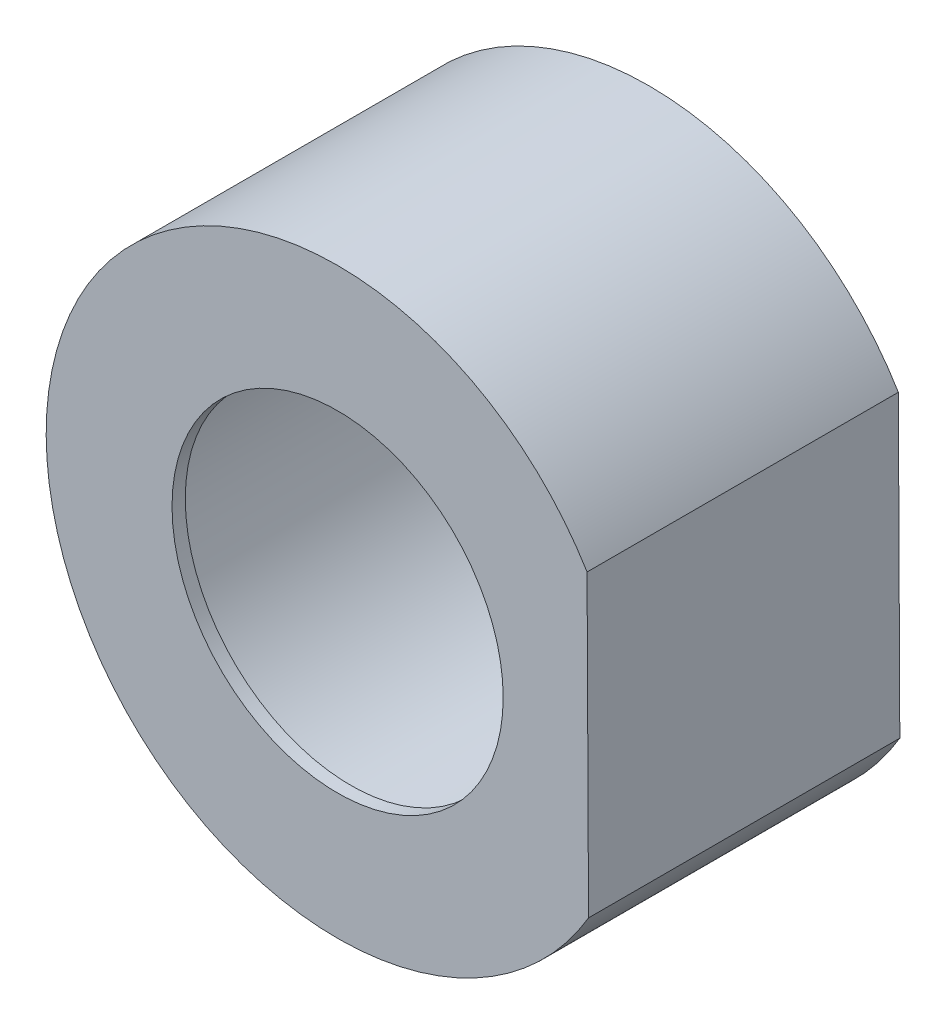
ISO-10303-21;
HEADER;
FILE_DESCRIPTION(('STEP AP214'),'2;1');
FILE_NAME('part.step','',(''),(''),'','','');
FILE_SCHEMA(('AUTOMOTIVE_DESIGN { 1 0 10303 214 1 1 1 1 }'));
ENDSEC;
DATA;
#1=APPLICATION_CONTEXT('core data for automotive mechanical design processes');
#2=APPLICATION_PROTOCOL_DEFINITION('international standard','automotive_design',2000,#1);
#3=PRODUCT_CONTEXT('',#1,'mechanical');
#4=PRODUCT('Part','Part','',(#3));
#5=PRODUCT_RELATED_PRODUCT_CATEGORY('part','',(#4));
#6=PRODUCT_DEFINITION_FORMATION('','',#4);
#7=PRODUCT_DEFINITION_CONTEXT('part definition',#1,'design');
#8=PRODUCT_DEFINITION('design','',#6,#7);
#9=PRODUCT_DEFINITION_SHAPE('','',#8);
#10=(LENGTH_UNIT() NAMED_UNIT(*) SI_UNIT(.MILLI.,.METRE.));
#11=(NAMED_UNIT(*) PLANE_ANGLE_UNIT() SI_UNIT($,.RADIAN.));
#12=(NAMED_UNIT(*) SI_UNIT($,.STERADIAN.) SOLID_ANGLE_UNIT());
#13=UNCERTAINTY_MEASURE_WITH_UNIT(LENGTH_MEASURE(1.E-05),#10,'distance_accuracy_value','');
#14=(GEOMETRIC_REPRESENTATION_CONTEXT(3) GLOBAL_UNCERTAINTY_ASSIGNED_CONTEXT((#13)) GLOBAL_UNIT_ASSIGNED_CONTEXT((#10,
#11,#12)) REPRESENTATION_CONTEXT('',''));
#15=CARTESIAN_POINT('',(0.,0.,0.));
#16=DIRECTION('',(0.,0.,1.));
#17=DIRECTION('',(1.,0.,0.));
#18=AXIS2_PLACEMENT_3D('',#15,#16,#17);
#19=CARTESIAN_POINT('',(19.1172584292297,-46.7893175505529,23.5));
#20=DIRECTION('',(-0.999988028182187,-0.00489320879401898,0.));
#21=DIRECTION('',(0.00489320879401898,-0.999988028182187,0.));
#22=AXIS2_PLACEMENT_3D('',#19,#20,#21);
#23=PLANE('',#22);
#24=DIRECTION('',(-0.00489320879401898,0.999988028182187,0.));
#25=VECTOR('',#24,1.);
#26=CARTESIAN_POINT('',(19.1172584292297,-46.7893175505529,0.));
#27=LINE('',#26,#25);
#28=CARTESIAN_POINT('',(18.9430493752666,-11.1875323626889,0.));
#29=VERTEX_POINT('',#28);
#30=CARTESIAN_POINT('',(18.8326576970166,11.3723789976856,0.));
#31=VERTEX_POINT('',#30);
#32=EDGE_CURVE('E65',#29,#31,#27,.T.);
#33=ORIENTED_EDGE('',*,*,#32,.T.);
#34=DIRECTION('',(0.,0.,-1.));
#35=VECTOR('',#34,1.);
#36=CARTESIAN_POINT('',(18.8326576970166,11.3723789976856,23.5));
#37=LINE('',#36,#35);
#38=CARTESIAN_POINT('',(18.8326576970166,11.3723789976856,23.5));
#39=VERTEX_POINT('',#38);
#40=EDGE_CURVE('E11',#39,#31,#37,.T.);
#41=ORIENTED_EDGE('',*,*,#40,.F.);
#42=DIRECTION('',(-0.00489320879401898,0.999988028182187,0.));
#43=VECTOR('',#42,1.);
#44=CARTESIAN_POINT('',(19.1172584292297,-46.7893175505529,23.5));
#45=LINE('',#44,#43);
#46=CARTESIAN_POINT('',(18.9430493752666,-11.1875323626889,23.5));
#47=VERTEX_POINT('',#46);
#48=EDGE_CURVE('E64',#47,#39,#45,.T.);
#49=ORIENTED_EDGE('',*,*,#48,.F.);
#50=DIRECTION('',(0.,0.,-1.));
#51=VECTOR('',#50,1.);
#52=CARTESIAN_POINT('',(18.9430493752666,-11.1875323626889,23.5));
#53=LINE('',#52,#51);
#54=EDGE_CURVE('E42',#47,#29,#53,.T.);
#55=ORIENTED_EDGE('',*,*,#54,.T.);
#56=EDGE_LOOP('',(#33,#41,#49,#55));
#57=FACE_BOUND('',#56,.T.);
#58=ADVANCED_FACE('F34',(#57),#23,.F.);
#59=CARTESIAN_POINT('',(0.,0.,23.5));
#60=DIRECTION('',(0.,0.,-1.));
#61=DIRECTION('',(-1.,0.,0.));
#62=AXIS2_PLACEMENT_3D('',#59,#60,#61);
#63=CYLINDRICAL_SURFACE('',#62,22.);
#64=CARTESIAN_POINT('',(0.,0.,0.));
#65=DIRECTION('',(0.,0.,1.));
#66=DIRECTION('',(1.,0.,0.));
#67=AXIS2_PLACEMENT_3D('',#64,#65,#66);
#68=CIRCLE('',#67,22.);
#69=EDGE_CURVE('E57',#31,#29,#68,.T.);
#70=ORIENTED_EDGE('',*,*,#69,.T.);
#71=ORIENTED_EDGE('',*,*,#54,.F.);
#72=CARTESIAN_POINT('',(0.,0.,23.5));
#73=DIRECTION('',(0.,0.,1.));
#74=DIRECTION('',(1.,0.,0.));
#75=AXIS2_PLACEMENT_3D('',#72,#73,#74);
#76=CIRCLE('',#75,22.);
#77=EDGE_CURVE('E49',#39,#47,#76,.T.);
#78=ORIENTED_EDGE('',*,*,#77,.F.);
#79=ORIENTED_EDGE('',*,*,#40,.T.);
#80=EDGE_LOOP('',(#70,#71,#78,#79));
#81=FACE_BOUND('',#80,.T.);
#82=ADVANCED_FACE('F60',(#81),#63,.T.);
#83=CARTESIAN_POINT('',(-1.52847531236671,-46.8903426459103,23.5));
#84=DIRECTION('',(0.,0.,1.));
#85=DIRECTION('',(1.,0.,0.));
#86=AXIS2_PLACEMENT_3D('',#83,#84,#85);
#87=PLANE('',#86);
#88=CARTESIAN_POINT('',(0.,0.,23.5));
#89=DIRECTION('',(0.,0.,-1.));
#90=DIRECTION('',(-1.,0.,0.));
#91=AXIS2_PLACEMENT_3D('',#88,#89,#90);
#92=CIRCLE('',#91,12.5);
#93=CARTESIAN_POINT('',(-12.5,0.,23.5));
#94=VERTEX_POINT('',#93);
#95=EDGE_CURVE('E78',#94,#94,#92,.T.);
#96=ORIENTED_EDGE('',*,*,#95,.T.);
#97=EDGE_LOOP('',(#96));
#98=FACE_BOUND('',#97,.T.);
#99=ORIENTED_EDGE('',*,*,#48,.T.);
#100=ORIENTED_EDGE('',*,*,#77,.T.);
#101=EDGE_LOOP('',(#99,#100));
#102=FACE_BOUND('',#101,.T.);
#103=ADVANCED_FACE('F86',(#98,#102),#87,.T.);
#104=CARTESIAN_POINT('',(-1.52847531236671,-46.8903426459103,0.));
#105=DIRECTION('',(0.,0.,1.));
#106=DIRECTION('',(1.,0.,0.));
#107=AXIS2_PLACEMENT_3D('',#104,#105,#106);
#108=PLANE('',#107);
#109=CARTESIAN_POINT('',(0.,0.,0.));
#110=DIRECTION('',(0.,0.,-1.));
#111=DIRECTION('',(-1.,0.,0.));
#112=AXIS2_PLACEMENT_3D('',#109,#110,#111);
#113=CIRCLE('',#112,16.);
#114=CARTESIAN_POINT('',(-16.,0.,0.));
#115=VERTEX_POINT('',#114);
#116=EDGE_CURVE('E72',#115,#115,#113,.T.);
#117=ORIENTED_EDGE('',*,*,#116,.F.);
#118=EDGE_LOOP('',(#117));
#119=FACE_BOUND('',#118,.T.);
#120=ORIENTED_EDGE('',*,*,#32,.F.);
#121=ORIENTED_EDGE('',*,*,#69,.F.);
#122=EDGE_LOOP('',(#120,#121));
#123=FACE_BOUND('',#122,.T.);
#124=ADVANCED_FACE('F68',(#119,#123),#108,.F.);
#125=CARTESIAN_POINT('',(0.,0.,22.5));
#126=DIRECTION('',(0.,0.,-1.));
#127=DIRECTION('',(-1.,0.,0.));
#128=AXIS2_PLACEMENT_3D('',#125,#126,#127);
#129=CYLINDRICAL_SURFACE('',#128,16.);
#130=CARTESIAN_POINT('',(0.,0.,22.5));
#131=DIRECTION('',(0.,0.,-1.));
#132=DIRECTION('',(-1.,0.,0.));
#133=AXIS2_PLACEMENT_3D('',#130,#131,#132);
#134=CIRCLE('',#133,16.);
#135=CARTESIAN_POINT('',(-16.,0.,22.5));
#136=VERTEX_POINT('',#135);
#137=EDGE_CURVE('E69',#136,#136,#134,.T.);
#138=CARTESIAN_POINT('',(-16.,0.,22.5));
#139=CARTESIAN_POINT('',(-16.,0.,22.265625));
#140=CARTESIAN_POINT('',(-16.,0.,22.03125));
#141=CARTESIAN_POINT('',(-16.,0.,21.5625));
#142=CARTESIAN_POINT('',(-16.,0.,21.328125));
#143=CARTESIAN_POINT('',(-16.,0.,20.859375));
#144=CARTESIAN_POINT('',(-16.,0.,20.625));
#145=CARTESIAN_POINT('',(-16.,0.,20.15625));
#146=CARTESIAN_POINT('',(-16.,0.,19.921875));
#147=CARTESIAN_POINT('',(-16.,0.,19.453125));
#148=CARTESIAN_POINT('',(-16.,0.,19.21875));
#149=CARTESIAN_POINT('',(-16.,0.,18.75));
#150=CARTESIAN_POINT('',(-16.,0.,18.515625));
#151=CARTESIAN_POINT('',(-16.,0.,18.046875));
#152=CARTESIAN_POINT('',(-16.,0.,17.8125));
#153=CARTESIAN_POINT('',(-16.,0.,17.34375));
#154=CARTESIAN_POINT('',(-16.,0.,17.109375));
#155=CARTESIAN_POINT('',(-16.,0.,16.640625));
#156=CARTESIAN_POINT('',(-16.,0.,16.40625));
#157=CARTESIAN_POINT('',(-16.,0.,15.9375));
#158=CARTESIAN_POINT('',(-16.,0.,15.703125));
#159=CARTESIAN_POINT('',(-16.,0.,15.234375));
#160=CARTESIAN_POINT('',(-16.,0.,15.));
#161=CARTESIAN_POINT('',(-16.,0.,14.53125));
#162=CARTESIAN_POINT('',(-16.,0.,14.296875));
#163=CARTESIAN_POINT('',(-16.,0.,13.828125));
#164=CARTESIAN_POINT('',(-16.,0.,13.59375));
#165=CARTESIAN_POINT('',(-16.,0.,13.125));
#166=CARTESIAN_POINT('',(-16.,0.,12.890625));
#167=CARTESIAN_POINT('',(-16.,0.,12.421875));
#168=CARTESIAN_POINT('',(-16.,0.,12.1875));
#169=CARTESIAN_POINT('',(-16.,0.,11.71875));
#170=CARTESIAN_POINT('',(-16.,0.,11.484375));
#171=CARTESIAN_POINT('',(-16.,0.,11.015625));
#172=CARTESIAN_POINT('',(-16.,0.,10.78125));
#173=CARTESIAN_POINT('',(-16.,0.,10.3125));
#174=CARTESIAN_POINT('',(-16.,0.,10.078125));
#175=CARTESIAN_POINT('',(-16.,0.,9.609375));
#176=CARTESIAN_POINT('',(-16.,0.,9.375));
#177=CARTESIAN_POINT('',(-16.,0.,8.90625));
#178=CARTESIAN_POINT('',(-16.,0.,8.671875));
#179=CARTESIAN_POINT('',(-16.,0.,8.203125));
#180=CARTESIAN_POINT('',(-16.,0.,7.96875));
#181=CARTESIAN_POINT('',(-16.,0.,7.5));
#182=CARTESIAN_POINT('',(-16.,0.,7.265625));
#183=CARTESIAN_POINT('',(-16.,0.,6.796875));
#184=CARTESIAN_POINT('',(-16.,0.,6.5625));
#185=CARTESIAN_POINT('',(-16.,0.,6.09375));
#186=CARTESIAN_POINT('',(-16.,0.,5.859375));
#187=CARTESIAN_POINT('',(-16.,0.,5.390625));
#188=CARTESIAN_POINT('',(-16.,0.,5.15625));
#189=CARTESIAN_POINT('',(-16.,0.,4.6875));
#190=CARTESIAN_POINT('',(-16.,0.,4.453125));
#191=CARTESIAN_POINT('',(-16.,0.,3.984375));
#192=CARTESIAN_POINT('',(-16.,0.,3.75));
#193=CARTESIAN_POINT('',(-16.,0.,3.28125));
#194=CARTESIAN_POINT('',(-16.,0.,3.046875));
#195=CARTESIAN_POINT('',(-16.,0.,2.578125));
#196=CARTESIAN_POINT('',(-16.,0.,2.34375));
#197=CARTESIAN_POINT('',(-16.,0.,1.875));
#198=CARTESIAN_POINT('',(-16.,0.,1.640625));
#199=CARTESIAN_POINT('',(-16.,0.,1.171875));
#200=CARTESIAN_POINT('',(-16.,0.,0.937500000000003));
#201=CARTESIAN_POINT('',(-16.,0.,0.468750000000003));
#202=CARTESIAN_POINT('',(-16.,0.,0.234375000000003));
#203=CARTESIAN_POINT('',(-16.,0.,0.));
#204=B_SPLINE_CURVE_WITH_KNOTS('',3,(#138,#139,#140,#141,#142,#143,#144,#145,#146,#147,#148,
#149,#150,#151,#152,#153,#154,#155,#156,#157,#158,#159,#160,#161,#162,#163,#164,#165,#166,#167,
#168,#169,#170,#171,#172,#173,#174,#175,#176,#177,#178,#179,#180,#181,#182,#183,#184,#185,#186,
#187,#188,#189,#190,#191,#192,#193,#194,#195,#196,#197,#198,#199,#200,#201,#202,#203),
.UNSPECIFIED.,.F.,.F.,(4,2,2,2,2,2,2,2,2,2,2,2,2,2,2,2,2,2,2,2,2,2,2,2,2,2,2,2,2,2,2,2,4),(0.,
0.703125000000002,1.40625,2.109375,2.8125,3.515625,4.21875,4.921875,5.625,6.328125,7.03125,
7.734375,8.4375,9.140625,9.84375,10.546875,11.25,11.953125,12.65625,13.359375,14.0625,14.765625,
15.46875,16.171875,16.875,17.578125,18.28125,18.984375,19.6875,20.390625,21.09375,21.796875,
22.5),.UNSPECIFIED.);
#205=EDGE_CURVE('BSEAM97',#136,#115,#204,.T.);
#206=ORIENTED_EDGE('',*,*,#137,.F.);
#207=ORIENTED_EDGE('',*,*,#116,.T.);
#208=ORIENTED_EDGE('',*,*,#205,.T.);
#209=ORIENTED_EDGE('',*,*,#205,.F.);
#210=EDGE_LOOP('',(#206,#208,#207,#209));
#211=FACE_BOUND('',#210,.T.);
#212=ADVANCED_FACE('F97',(#211),#129,.F.);
#213=CARTESIAN_POINT('',(0.,0.,22.5));
#214=DIRECTION('',(0.,0.,-1.));
#215=DIRECTION('',(-1.,0.,0.));
#216=AXIS2_PLACEMENT_3D('',#213,#214,#215);
#217=PLANE('',#216);
#218=CARTESIAN_POINT('',(0.,0.,22.5));
#219=DIRECTION('',(0.,0.,-1.));
#220=DIRECTION('',(-1.,0.,0.));
#221=AXIS2_PLACEMENT_3D('',#218,#219,#220);
#222=CIRCLE('',#221,12.5);
#223=CARTESIAN_POINT('',(-12.5,0.,22.5));
#224=VERTEX_POINT('',#223);
#225=EDGE_CURVE('E80',#224,#224,#222,.T.);
#226=ORIENTED_EDGE('',*,*,#225,.F.);
#227=EDGE_LOOP('',(#226));
#228=FACE_BOUND('',#227,.T.);
#229=ORIENTED_EDGE('',*,*,#137,.T.);
#230=EDGE_LOOP('',(#229));
#231=FACE_BOUND('',#230,.T.);
#232=ADVANCED_FACE('F91',(#228,#231),#217,.T.);
#233=CARTESIAN_POINT('',(0.,0.,23.5));
#234=DIRECTION('',(0.,0.,-1.));
#235=DIRECTION('',(-1.,0.,0.));
#236=AXIS2_PLACEMENT_3D('',#233,#234,#235);
#237=CYLINDRICAL_SURFACE('',#236,12.5);
#238=ORIENTED_EDGE('',*,*,#95,.F.);
#239=EDGE_LOOP('',(#238));
#240=FACE_BOUND('',#239,.T.);
#241=ORIENTED_EDGE('',*,*,#225,.T.);
#242=EDGE_LOOP('',(#241));
#243=FACE_BOUND('',#242,.T.);
#244=ADVANCED_FACE('F88',(#240,#243),#237,.F.);
#245=CLOSED_SHELL('',(#58,#82,#103,#124,#212,#232,#244));
#246=MANIFOLD_SOLID_BREP('B2',#245);
#247=ADVANCED_BREP_SHAPE_REPRESENTATION('',(#18,#246),#14);
#248=SHAPE_DEFINITION_REPRESENTATION(#9,#247);
ENDSEC;
END-ISO-10303-21;
